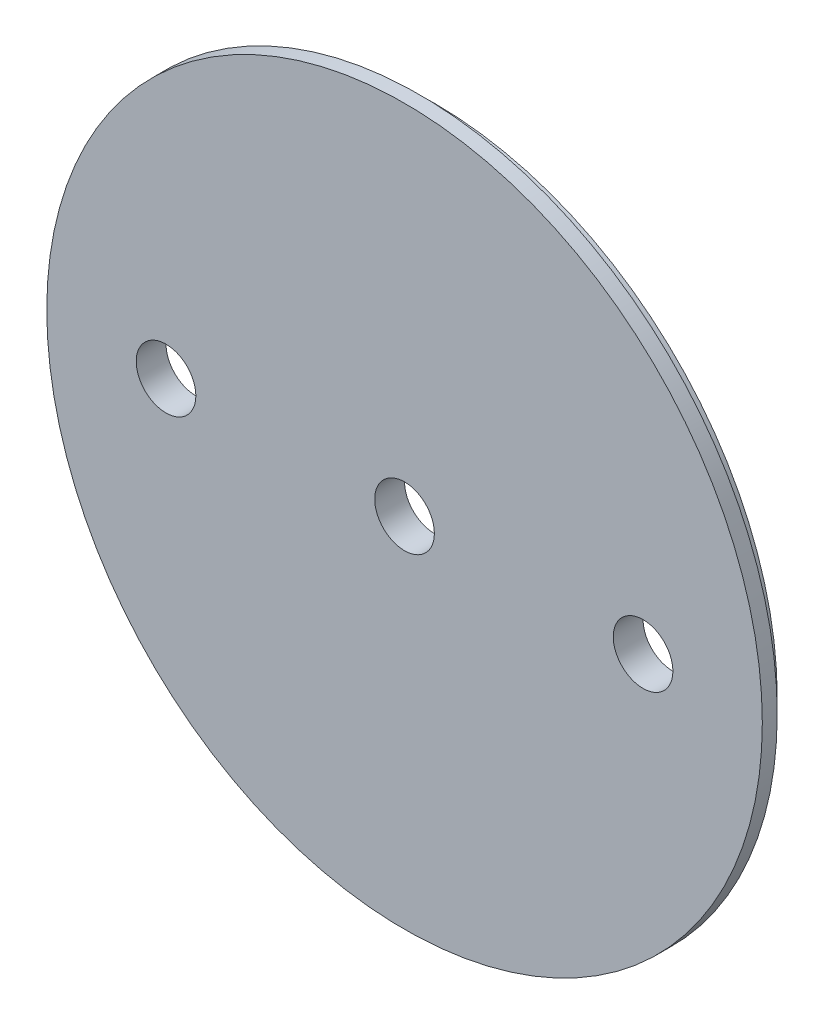
ISO-10303-21;
HEADER;
FILE_DESCRIPTION(('STEP AP214'),'2;1');
FILE_NAME('part.step','',(''),(''),'','','');
FILE_SCHEMA(('AUTOMOTIVE_DESIGN { 1 0 10303 214 1 1 1 1 }'));
ENDSEC;
DATA;
#1=APPLICATION_CONTEXT('core data for automotive mechanical design processes');
#2=APPLICATION_PROTOCOL_DEFINITION('international standard','automotive_design',2000,#1);
#3=PRODUCT_CONTEXT('',#1,'mechanical');
#4=PRODUCT('Part','Part','',(#3));
#5=PRODUCT_RELATED_PRODUCT_CATEGORY('part','',(#4));
#6=PRODUCT_DEFINITION_FORMATION('','',#4);
#7=PRODUCT_DEFINITION_CONTEXT('part definition',#1,'design');
#8=PRODUCT_DEFINITION('design','',#6,#7);
#9=PRODUCT_DEFINITION_SHAPE('','',#8);
#10=(LENGTH_UNIT() NAMED_UNIT(*) SI_UNIT(.MILLI.,.METRE.));
#11=(NAMED_UNIT(*) PLANE_ANGLE_UNIT() SI_UNIT($,.RADIAN.));
#12=(NAMED_UNIT(*) SI_UNIT($,.STERADIAN.) SOLID_ANGLE_UNIT());
#13=UNCERTAINTY_MEASURE_WITH_UNIT(LENGTH_MEASURE(1.E-05),#10,'distance_accuracy_value','');
#14=(GEOMETRIC_REPRESENTATION_CONTEXT(3) GLOBAL_UNCERTAINTY_ASSIGNED_CONTEXT((#13)) GLOBAL_UNIT_ASSIGNED_CONTEXT((#10,
#11,#12)) REPRESENTATION_CONTEXT('',''));
#15=CARTESIAN_POINT('',(0.,0.,0.));
#16=DIRECTION('',(0.,0.,1.));
#17=DIRECTION('',(1.,0.,0.));
#18=AXIS2_PLACEMENT_3D('',#15,#16,#17);
#19=CARTESIAN_POINT('',(0.,0.,3.175));
#20=DIRECTION('',(0.,0.,-1.));
#21=DIRECTION('',(-1.,0.,0.));
#22=AXIS2_PLACEMENT_3D('',#19,#20,#21);
#23=CYLINDRICAL_SURFACE('',#22,38.1);
#24=CARTESIAN_POINT('',(0.,0.,3.175));
#25=DIRECTION('',(0.,0.,1.));
#26=DIRECTION('',(1.,0.,0.));
#27=AXIS2_PLACEMENT_3D('',#24,#25,#26);
#28=CIRCLE('',#27,38.1);
#29=CARTESIAN_POINT('',(38.1,0.,3.175));
#30=VERTEX_POINT('',#29);
#31=EDGE_CURVE('E11',#30,#30,#28,.T.);
#32=ORIENTED_EDGE('',*,*,#31,.F.);
#33=EDGE_LOOP('',(#32));
#34=FACE_BOUND('',#33,.T.);
#35=CARTESIAN_POINT('',(0.,0.,1.5875));
#36=DIRECTION('',(0.,0.,-1.));
#37=DIRECTION('',(-1.,0.,0.));
#38=AXIS2_PLACEMENT_3D('',#35,#36,#37);
#39=CIRCLE('',#38,38.1);
#40=CARTESIAN_POINT('',(-38.1,0.,1.5875));
#41=VERTEX_POINT('',#40);
#42=EDGE_CURVE('E56',#41,#41,#39,.T.);
#43=ORIENTED_EDGE('',*,*,#42,.F.);
#44=EDGE_LOOP('',(#43));
#45=FACE_BOUND('',#44,.T.);
#46=ADVANCED_FACE('F49',(#34,#45),#23,.T.);
#47=CARTESIAN_POINT('',(0.,0.,3.175));
#48=DIRECTION('',(0.,0.,1.));
#49=DIRECTION('',(1.,0.,0.));
#50=AXIS2_PLACEMENT_3D('',#47,#48,#49);
#51=PLANE('',#50);
#52=CARTESIAN_POINT('',(-25.4,0.,3.175));
#53=DIRECTION('',(0.,0.,1.));
#54=DIRECTION('',(1.,0.,0.));
#55=AXIS2_PLACEMENT_3D('',#52,#53,#54);
#56=CIRCLE('',#55,3.175);
#57=CARTESIAN_POINT('',(-22.225,0.,3.175));
#58=VERTEX_POINT('',#57);
#59=EDGE_CURVE('E85',#58,#58,#56,.T.);
#60=ORIENTED_EDGE('',*,*,#59,.F.);
#61=EDGE_LOOP('',(#60));
#62=FACE_BOUND('',#61,.T.);
#63=CARTESIAN_POINT('',(25.4,0.,3.175));
#64=DIRECTION('',(0.,0.,1.));
#65=DIRECTION('',(1.,0.,0.));
#66=AXIS2_PLACEMENT_3D('',#63,#64,#65);
#67=CIRCLE('',#66,3.175);
#68=CARTESIAN_POINT('',(28.575,0.,3.175));
#69=VERTEX_POINT('',#68);
#70=EDGE_CURVE('E77',#69,#69,#67,.T.);
#71=ORIENTED_EDGE('',*,*,#70,.F.);
#72=EDGE_LOOP('',(#71));
#73=FACE_BOUND('',#72,.T.);
#74=CARTESIAN_POINT('',(0.,0.,3.175));
#75=DIRECTION('',(0.,0.,1.));
#76=DIRECTION('',(1.,0.,0.));
#77=AXIS2_PLACEMENT_3D('',#74,#75,#76);
#78=CIRCLE('',#77,3.175);
#79=CARTESIAN_POINT('',(3.175,0.,3.175));
#80=VERTEX_POINT('',#79);
#81=EDGE_CURVE('E73',#80,#80,#78,.T.);
#82=ORIENTED_EDGE('',*,*,#81,.F.);
#83=EDGE_LOOP('',(#82));
#84=FACE_BOUND('',#83,.T.);
#85=ORIENTED_EDGE('',*,*,#31,.T.);
#86=EDGE_LOOP('',(#85));
#87=FACE_BOUND('',#86,.T.);
#88=ADVANCED_FACE('F99',(#62,#73,#84,#87),#51,.T.);
#89=CARTESIAN_POINT('',(0.,0.,1.5875));
#90=DIRECTION('',(0.,0.,-1.));
#91=DIRECTION('',(-1.,0.,0.));
#92=AXIS2_PLACEMENT_3D('',#89,#90,#91);
#93=PLANE('',#92);
#94=CARTESIAN_POINT('',(0.,0.,1.5875));
#95=DIRECTION('',(0.,0.,-1.));
#96=DIRECTION('',(-1.,0.,0.));
#97=AXIS2_PLACEMENT_3D('',#94,#95,#96);
#98=CIRCLE('',#97,36.5125);
#99=CARTESIAN_POINT('',(-36.5125,0.,1.5875));
#100=VERTEX_POINT('',#99);
#101=EDGE_CURVE('E61',#100,#100,#98,.T.);
#102=ORIENTED_EDGE('',*,*,#101,.F.);
#103=EDGE_LOOP('',(#102));
#104=FACE_BOUND('',#103,.T.);
#105=ORIENTED_EDGE('',*,*,#42,.T.);
#106=EDGE_LOOP('',(#105));
#107=FACE_BOUND('',#106,.T.);
#108=ADVANCED_FACE('F102',(#104,#107),#93,.T.);
#109=CARTESIAN_POINT('',(0.,0.,1.5875));
#110=DIRECTION('',(0.,0.,-1.));
#111=DIRECTION('',(-1.,0.,0.));
#112=AXIS2_PLACEMENT_3D('',#109,#110,#111);
#113=CYLINDRICAL_SURFACE('',#112,36.5125);
#114=ORIENTED_EDGE('',*,*,#101,.T.);
#115=EDGE_LOOP('',(#114));
#116=FACE_BOUND('',#115,.T.);
#117=CARTESIAN_POINT('',(0.,0.,0.));
#118=DIRECTION('',(0.,0.,-1.));
#119=DIRECTION('',(-1.,0.,0.));
#120=AXIS2_PLACEMENT_3D('',#117,#118,#119);
#121=CIRCLE('',#120,36.5125);
#122=CARTESIAN_POINT('',(-36.5125,0.,0.));
#123=VERTEX_POINT('',#122);
#124=EDGE_CURVE('E66',#123,#123,#121,.T.);
#125=ORIENTED_EDGE('',*,*,#124,.F.);
#126=EDGE_LOOP('',(#125));
#127=FACE_BOUND('',#126,.T.);
#128=ADVANCED_FACE('F119',(#116,#127),#113,.T.);
#129=CARTESIAN_POINT('',(0.,0.,0.));
#130=DIRECTION('',(0.,0.,1.));
#131=DIRECTION('',(1.,0.,0.));
#132=AXIS2_PLACEMENT_3D('',#129,#130,#131);
#133=PLANE('',#132);
#134=CARTESIAN_POINT('',(-25.4,0.,0.));
#135=DIRECTION('',(0.,0.,1.));
#136=DIRECTION('',(1.,0.,0.));
#137=AXIS2_PLACEMENT_3D('',#134,#135,#136);
#138=CIRCLE('',#137,3.175);
#139=CARTESIAN_POINT('',(-22.225,0.,0.));
#140=VERTEX_POINT('',#139);
#141=EDGE_CURVE('E81',#140,#140,#138,.T.);
#142=ORIENTED_EDGE('',*,*,#141,.T.);
#143=EDGE_LOOP('',(#142));
#144=FACE_BOUND('',#143,.T.);
#145=CARTESIAN_POINT('',(25.4,0.,0.));
#146=DIRECTION('',(0.,0.,1.));
#147=DIRECTION('',(1.,0.,0.));
#148=AXIS2_PLACEMENT_3D('',#145,#146,#147);
#149=CIRCLE('',#148,3.175);
#150=CARTESIAN_POINT('',(28.575,0.,0.));
#151=VERTEX_POINT('',#150);
#152=EDGE_CURVE('E89',#151,#151,#149,.T.);
#153=ORIENTED_EDGE('',*,*,#152,.T.);
#154=EDGE_LOOP('',(#153));
#155=FACE_BOUND('',#154,.T.);
#156=CARTESIAN_POINT('',(0.,0.,0.));
#157=DIRECTION('',(0.,0.,1.));
#158=DIRECTION('',(1.,0.,0.));
#159=AXIS2_PLACEMENT_3D('',#156,#157,#158);
#160=CIRCLE('',#159,3.175);
#161=CARTESIAN_POINT('',(3.175,0.,0.));
#162=VERTEX_POINT('',#161);
#163=EDGE_CURVE('E71',#162,#162,#160,.T.);
#164=ORIENTED_EDGE('',*,*,#163,.T.);
#165=EDGE_LOOP('',(#164));
#166=FACE_BOUND('',#165,.T.);
#167=ORIENTED_EDGE('',*,*,#124,.T.);
#168=EDGE_LOOP('',(#167));
#169=FACE_BOUND('',#168,.T.);
#170=ADVANCED_FACE('F109',(#144,#155,#166,#169),#133,.F.);
#171=CARTESIAN_POINT('',(0.,0.,0.));
#172=DIRECTION('',(0.,0.,1.));
#173=DIRECTION('',(1.,0.,0.));
#174=AXIS2_PLACEMENT_3D('',#171,#172,#173);
#175=CYLINDRICAL_SURFACE('',#174,3.175);
#176=ORIENTED_EDGE('',*,*,#163,.F.);
#177=EDGE_LOOP('',(#176));
#178=FACE_BOUND('',#177,.T.);
#179=ORIENTED_EDGE('',*,*,#81,.T.);
#180=EDGE_LOOP('',(#179));
#181=FACE_BOUND('',#180,.T.);
#182=ADVANCED_FACE('F107',(#178,#181),#175,.F.);
#183=CARTESIAN_POINT('',(25.4,0.,0.));
#184=DIRECTION('',(0.,0.,1.));
#185=DIRECTION('',(1.,0.,0.));
#186=AXIS2_PLACEMENT_3D('',#183,#184,#185);
#187=CYLINDRICAL_SURFACE('',#186,3.175);
#188=ORIENTED_EDGE('',*,*,#152,.F.);
#189=EDGE_LOOP('',(#188));
#190=FACE_BOUND('',#189,.T.);
#191=ORIENTED_EDGE('',*,*,#70,.T.);
#192=EDGE_LOOP('',(#191));
#193=FACE_BOUND('',#192,.T.);
#194=ADVANCED_FACE('F97',(#190,#193),#187,.F.);
#195=CARTESIAN_POINT('',(-25.4,0.,0.));
#196=DIRECTION('',(0.,0.,1.));
#197=DIRECTION('',(1.,0.,0.));
#198=AXIS2_PLACEMENT_3D('',#195,#196,#197);
#199=CYLINDRICAL_SURFACE('',#198,3.175);
#200=ORIENTED_EDGE('',*,*,#141,.F.);
#201=EDGE_LOOP('',(#200));
#202=FACE_BOUND('',#201,.T.);
#203=ORIENTED_EDGE('',*,*,#59,.T.);
#204=EDGE_LOOP('',(#203));
#205=FACE_BOUND('',#204,.T.);
#206=ADVANCED_FACE('F116',(#202,#205),#199,.F.);
#207=CLOSED_SHELL('',(#46,#88,#108,#128,#170,#182,#194,#206));
#208=MANIFOLD_SOLID_BREP('B2',#207);
#209=ADVANCED_BREP_SHAPE_REPRESENTATION('',(#18,#208),#14);
#210=SHAPE_DEFINITION_REPRESENTATION(#9,#209);
ENDSEC;
END-ISO-10303-21;
